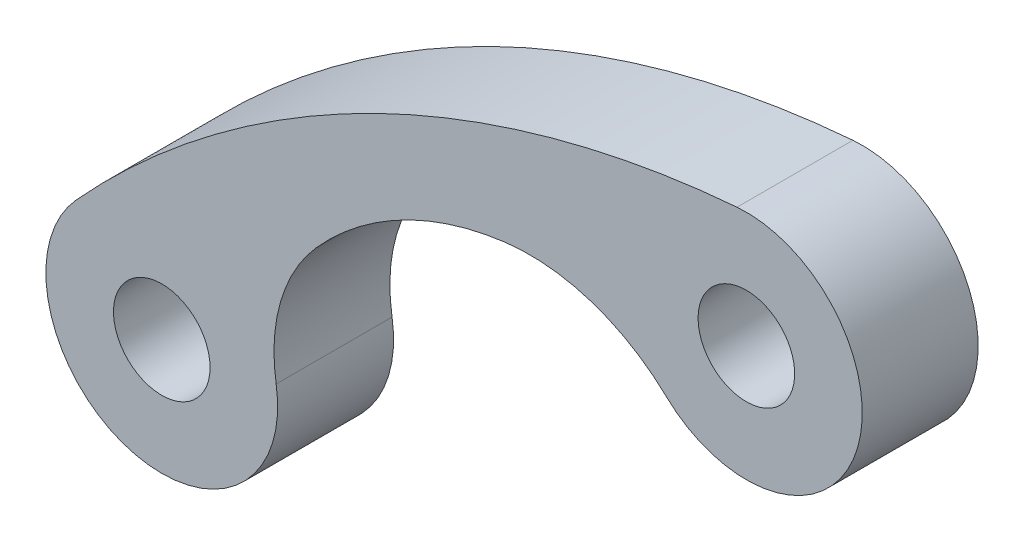
ISO-10303-21;
HEADER;
FILE_DESCRIPTION(('STEP AP214'),'2;1');
FILE_NAME('part.step','',(''),(''),'','','');
FILE_SCHEMA(('AUTOMOTIVE_DESIGN { 1 0 10303 214 1 1 1 1 }'));
ENDSEC;
DATA;
#1=APPLICATION_CONTEXT('core data for automotive mechanical design processes');
#2=APPLICATION_PROTOCOL_DEFINITION('international standard','automotive_design',2000,#1);
#3=PRODUCT_CONTEXT('',#1,'mechanical');
#4=PRODUCT('Part','Part','',(#3));
#5=PRODUCT_RELATED_PRODUCT_CATEGORY('part','',(#4));
#6=PRODUCT_DEFINITION_FORMATION('','',#4);
#7=PRODUCT_DEFINITION_CONTEXT('part definition',#1,'design');
#8=PRODUCT_DEFINITION('design','',#6,#7);
#9=PRODUCT_DEFINITION_SHAPE('','',#8);
#10=(LENGTH_UNIT() NAMED_UNIT(*) SI_UNIT(.MILLI.,.METRE.));
#11=(NAMED_UNIT(*) PLANE_ANGLE_UNIT() SI_UNIT($,.RADIAN.));
#12=(NAMED_UNIT(*) SI_UNIT($,.STERADIAN.) SOLID_ANGLE_UNIT());
#13=UNCERTAINTY_MEASURE_WITH_UNIT(LENGTH_MEASURE(1.E-05),#10,'distance_accuracy_value','');
#14=(GEOMETRIC_REPRESENTATION_CONTEXT(3) GLOBAL_UNCERTAINTY_ASSIGNED_CONTEXT((#13)) GLOBAL_UNIT_ASSIGNED_CONTEXT((#10,
#11,#12)) REPRESENTATION_CONTEXT('',''));
#15=CARTESIAN_POINT('',(0.,0.,0.));
#16=DIRECTION('',(0.,0.,1.));
#17=DIRECTION('',(1.,0.,0.));
#18=AXIS2_PLACEMENT_3D('',#15,#16,#17);
#19=CARTESIAN_POINT('',(0.,0.,7.));
#20=DIRECTION('',(0.,0.,1.));
#21=DIRECTION('',(1.,0.,0.));
#22=AXIS2_PLACEMENT_3D('',#19,#20,#21);
#23=CYLINDRICAL_SURFACE('',#22,3.);
#24=CARTESIAN_POINT('',(0.,0.,10.));
#25=DIRECTION('',(0.,0.,1.));
#26=DIRECTION('',(1.,0.,0.));
#27=AXIS2_PLACEMENT_3D('',#24,#25,#26);
#28=CIRCLE('',#27,3.);
#29=CARTESIAN_POINT('',(-2.21653776283587,2.02162319583115,10.));
#30=VERTEX_POINT('',#29);
#31=CARTESIAN_POINT('',(2.96055643657595,0.48487687699943,10.));
#32=VERTEX_POINT('',#31);
#33=EDGE_CURVE('E125',#30,#32,#28,.T.);
#34=ORIENTED_EDGE('',*,*,#33,.F.);
#35=DIRECTION('',(0.,0.,1.));
#36=VECTOR('',#35,1.);
#37=CARTESIAN_POINT('',(-2.21653776283587,2.02162319583115,7.));
#38=LINE('',#37,#36);
#39=CARTESIAN_POINT('',(-2.21653776283587,2.02162319583115,7.));
#40=VERTEX_POINT('',#39);
#41=EDGE_CURVE('E11',#40,#30,#38,.T.);
#42=ORIENTED_EDGE('',*,*,#41,.F.);
#43=CARTESIAN_POINT('',(0.,0.,7.));
#44=DIRECTION('',(0.,0.,1.));
#45=DIRECTION('',(1.,0.,0.));
#46=AXIS2_PLACEMENT_3D('',#43,#44,#45);
#47=CIRCLE('',#46,3.);
#48=CARTESIAN_POINT('',(2.96055643657595,0.48487687699943,7.));
#49=VERTEX_POINT('',#48);
#50=EDGE_CURVE('E139',#40,#49,#47,.T.);
#51=ORIENTED_EDGE('',*,*,#50,.T.);
#52=DIRECTION('',(0.,0.,1.));
#53=VECTOR('',#52,1.);
#54=CARTESIAN_POINT('',(2.96055643657595,0.48487687699943,7.));
#55=LINE('',#54,#53);
#56=EDGE_CURVE('E42',#49,#32,#55,.T.);
#57=ORIENTED_EDGE('',*,*,#56,.T.);
#58=EDGE_LOOP('',(#34,#42,#51,#57));
#59=FACE_BOUND('',#58,.T.);
#60=ADVANCED_FACE('F39',(#59),#23,.T.);
#61=CARTESIAN_POINT('',(16.9848295192665,-15.4912431040452,7.));
#62=DIRECTION('',(0.,0.,1.));
#63=DIRECTION('',(1.,0.,0.));
#64=AXIS2_PLACEMENT_3D('',#61,#62,#63);
#65=CYLINDRICAL_SURFACE('',#64,25.9883241387269);
#66=CARTESIAN_POINT('',(16.9848295192665,-15.4912431040452,10.));
#67=DIRECTION('',(0.,0.,1.));
#68=DIRECTION('',(1.,0.,0.));
#69=AXIS2_PLACEMENT_3D('',#66,#67,#68);
#70=CIRCLE('',#69,25.9883241387269);
#71=CARTESIAN_POINT('',(14.8888412285228,10.4124212047857,10.));
#72=VERTEX_POINT('',#71);
#73=EDGE_CURVE('E138',#30,#72,#70,.F.);
#74=ORIENTED_EDGE('',*,*,#73,.T.);
#75=DIRECTION('',(0.,0.,1.));
#76=VECTOR('',#75,1.);
#77=CARTESIAN_POINT('',(14.8888412285228,10.4124212047857,7.));
#78=LINE('',#77,#76);
#79=CARTESIAN_POINT('',(14.8888412285228,10.4124212047857,7.));
#80=VERTEX_POINT('',#79);
#81=EDGE_CURVE('E48',#80,#72,#78,.T.);
#82=ORIENTED_EDGE('',*,*,#81,.F.);
#83=CARTESIAN_POINT('',(16.9848295192665,-15.4912431040452,7.));
#84=DIRECTION('',(0.,0.,1.));
#85=DIRECTION('',(1.,0.,0.));
#86=AXIS2_PLACEMENT_3D('',#83,#84,#85);
#87=CIRCLE('',#86,25.9883241387269);
#88=EDGE_CURVE('E115',#40,#80,#87,.F.);
#89=ORIENTED_EDGE('',*,*,#88,.F.);
#90=ORIENTED_EDGE('',*,*,#41,.T.);
#91=EDGE_LOOP('',(#74,#82,#89,#90));
#92=FACE_BOUND('',#91,.T.);
#93=ADVANCED_FACE('F147',(#92),#65,.T.);
#94=CARTESIAN_POINT('',(15.130794685724,7.42219403539736,7.));
#95=DIRECTION('',(0.,0.,1.));
#96=DIRECTION('',(1.,0.,0.));
#97=AXIS2_PLACEMENT_3D('',#94,#95,#96);
#98=CYLINDRICAL_SURFACE('',#97,2.99999999999998);
#99=CARTESIAN_POINT('',(15.130794685724,7.42219403539736,10.));
#100=DIRECTION('',(0.,0.,1.));
#101=DIRECTION('',(1.,0.,0.));
#102=AXIS2_PLACEMENT_3D('',#99,#100,#101);
#103=CIRCLE('',#102,2.99999999999998);
#104=CARTESIAN_POINT('',(13.0628321585044,5.24882545505593,10.));
#105=VERTEX_POINT('',#104);
#106=EDGE_CURVE('E101',#105,#72,#103,.T.);
#107=ORIENTED_EDGE('',*,*,#106,.F.);
#108=DIRECTION('',(0.,0.,1.));
#109=VECTOR('',#108,1.);
#110=CARTESIAN_POINT('',(13.0628321585044,5.24882545505593,7.));
#111=LINE('',#110,#109);
#112=CARTESIAN_POINT('',(13.0628321585044,5.24882545505593,7.));
#113=VERTEX_POINT('',#112);
#114=EDGE_CURVE('E96',#113,#105,#111,.T.);
#115=ORIENTED_EDGE('',*,*,#114,.F.);
#116=CARTESIAN_POINT('',(15.130794685724,7.42219403539736,7.));
#117=DIRECTION('',(0.,0.,1.));
#118=DIRECTION('',(1.,0.,0.));
#119=AXIS2_PLACEMENT_3D('',#116,#117,#118);
#120=CIRCLE('',#119,2.99999999999998);
#121=EDGE_CURVE('E99',#113,#80,#120,.T.);
#122=ORIENTED_EDGE('',*,*,#121,.T.);
#123=ORIENTED_EDGE('',*,*,#81,.T.);
#124=EDGE_LOOP('',(#107,#115,#122,#123));
#125=FACE_BOUND('',#124,.T.);
#126=ADVANCED_FACE('F98',(#125),#98,.T.);
#127=CARTESIAN_POINT('',(9.52107516452226,1.52654167640606,7.));
#128=DIRECTION('',(0.,0.,1.));
#129=DIRECTION('',(1.,0.,0.));
#130=AXIS2_PLACEMENT_3D('',#127,#128,#129);
#131=CYLINDRICAL_SURFACE('',#130,5.13803845190182);
#132=CARTESIAN_POINT('',(9.52107516452226,1.52654167640606,10.));
#133=DIRECTION('',(0.,0.,1.));
#134=DIRECTION('',(1.,0.,0.));
#135=AXIS2_PLACEMENT_3D('',#132,#133,#134);
#136=CIRCLE('',#135,5.13803845190182);
#137=CARTESIAN_POINT('',(8.88421615339304,6.62495807104912,10.));
#138=VERTEX_POINT('',#137);
#139=EDGE_CURVE('E135',#138,#105,#136,.F.);
#140=ORIENTED_EDGE('',*,*,#139,.F.);
#141=DIRECTION('',(0.,0.,1.));
#142=VECTOR('',#141,1.);
#143=CARTESIAN_POINT('',(8.88421615339304,6.62495807104912,7.));
#144=LINE('',#143,#142);
#145=CARTESIAN_POINT('',(8.88421615339304,6.62495807104912,7.));
#146=VERTEX_POINT('',#145);
#147=EDGE_CURVE('E106',#146,#138,#144,.T.);
#148=ORIENTED_EDGE('',*,*,#147,.F.);
#149=CARTESIAN_POINT('',(9.52107516452226,1.52654167640606,7.));
#150=DIRECTION('',(0.,0.,1.));
#151=DIRECTION('',(1.,0.,0.));
#152=AXIS2_PLACEMENT_3D('',#149,#150,#151);
#153=CIRCLE('',#152,5.13803845190182);
#154=EDGE_CURVE('E113',#146,#113,#153,.F.);
#155=ORIENTED_EDGE('',*,*,#154,.T.);
#156=ORIENTED_EDGE('',*,*,#114,.T.);
#157=EDGE_LOOP('',(#140,#148,#155,#156));
#158=FACE_BOUND('',#157,.T.);
#159=ADVANCED_FACE('F117',(#158),#131,.F.);
#160=CARTESIAN_POINT('',(9.85679026823962,-1.16104750551823,7.));
#161=DIRECTION('',(0.,0.,1.));
#162=DIRECTION('',(1.,0.,0.));
#163=AXIS2_PLACEMENT_3D('',#160,#161,#162);
#164=CYLINDRICAL_SURFACE('',#163,7.84651408252145);
#165=CARTESIAN_POINT('',(9.85679026823962,-1.16104750551823,10.));
#166=DIRECTION('',(0.,0.,1.));
#167=DIRECTION('',(1.,0.,0.));
#168=AXIS2_PLACEMENT_3D('',#165,#166,#167);
#169=CIRCLE('',#168,7.84651408252145);
#170=CARTESIAN_POINT('',(4.,4.06061803347036,10.));
#171=VERTEX_POINT('',#170);
#172=EDGE_CURVE('E132',#171,#138,#169,.F.);
#173=ORIENTED_EDGE('',*,*,#172,.F.);
#174=DIRECTION('',(0.,0.,1.));
#175=VECTOR('',#174,1.);
#176=CARTESIAN_POINT('',(4.,4.06061803347036,7.));
#177=LINE('',#176,#175);
#178=CARTESIAN_POINT('',(4.,4.06061803347036,7.));
#179=VERTEX_POINT('',#178);
#180=EDGE_CURVE('E142',#179,#171,#177,.T.);
#181=ORIENTED_EDGE('',*,*,#180,.F.);
#182=CARTESIAN_POINT('',(9.85679026823962,-1.16104750551823,7.));
#183=DIRECTION('',(0.,0.,1.));
#184=DIRECTION('',(1.,0.,0.));
#185=AXIS2_PLACEMENT_3D('',#182,#183,#184);
#186=CIRCLE('',#185,7.84651408252145);
#187=EDGE_CURVE('E118',#179,#146,#186,.F.);
#188=ORIENTED_EDGE('',*,*,#187,.T.);
#189=ORIENTED_EDGE('',*,*,#147,.T.);
#190=EDGE_LOOP('',(#173,#181,#188,#189));
#191=FACE_BOUND('',#190,.T.);
#192=ADVANCED_FACE('F182',(#191),#164,.F.);
#193=CARTESIAN_POINT('',(7.22693484919939,1.18361992923564,7.));
#194=DIRECTION('',(0.,0.,1.));
#195=DIRECTION('',(1.,0.,0.));
#196=AXIS2_PLACEMENT_3D('',#193,#194,#195);
#197=CYLINDRICAL_SURFACE('',#196,4.32321947311812);
#198=CARTESIAN_POINT('',(7.22693484919939,1.18361992923564,10.));
#199=DIRECTION('',(0.,0.,1.));
#200=DIRECTION('',(1.,0.,0.));
#201=AXIS2_PLACEMENT_3D('',#198,#199,#200);
#202=CIRCLE('',#201,4.32321947311812);
#203=EDGE_CURVE('E128',#32,#171,#202,.F.);
#204=ORIENTED_EDGE('',*,*,#203,.F.);
#205=ORIENTED_EDGE('',*,*,#56,.F.);
#206=CARTESIAN_POINT('',(7.22693484919939,1.18361992923564,7.));
#207=DIRECTION('',(0.,0.,1.));
#208=DIRECTION('',(1.,0.,0.));
#209=AXIS2_PLACEMENT_3D('',#206,#207,#208);
#210=CIRCLE('',#209,4.32321947311812);
#211=EDGE_CURVE('E120',#49,#179,#210,.F.);
#212=ORIENTED_EDGE('',*,*,#211,.T.);
#213=ORIENTED_EDGE('',*,*,#180,.T.);
#214=EDGE_LOOP('',(#204,#205,#212,#213));
#215=FACE_BOUND('',#214,.T.);
#216=ADVANCED_FACE('F144',(#215),#197,.F.);
#217=CARTESIAN_POINT('',(0.,0.,7.));
#218=DIRECTION('',(0.,0.,1.));
#219=DIRECTION('',(1.,0.,0.));
#220=AXIS2_PLACEMENT_3D('',#217,#218,#219);
#221=PLANE('',#220);
#222=CARTESIAN_POINT('',(0.,0.,7.));
#223=DIRECTION('',(0.,0.,1.));
#224=DIRECTION('',(1.,0.,0.));
#225=AXIS2_PLACEMENT_3D('',#222,#223,#224);
#226=CIRCLE('',#225,1.25);
#227=CARTESIAN_POINT('',(1.25,0.,7.));
#228=VERTEX_POINT('',#227);
#229=EDGE_CURVE('E155',#228,#228,#226,.F.);
#230=ORIENTED_EDGE('',*,*,#229,.F.);
#231=EDGE_LOOP('',(#230));
#232=FACE_BOUND('',#231,.T.);
#233=CARTESIAN_POINT('',(15.130794685724,7.42219403539736,7.));
#234=DIRECTION('',(0.,0.,1.));
#235=DIRECTION('',(1.,0.,0.));
#236=AXIS2_PLACEMENT_3D('',#233,#234,#235);
#237=CIRCLE('',#236,1.25);
#238=CARTESIAN_POINT('',(16.380794685724,7.42219403539736,7.));
#239=VERTEX_POINT('',#238);
#240=EDGE_CURVE('E129',#239,#239,#237,.T.);
#241=ORIENTED_EDGE('',*,*,#240,.T.);
#242=EDGE_LOOP('',(#241));
#243=FACE_BOUND('',#242,.T.);
#244=ORIENTED_EDGE('',*,*,#50,.F.);
#245=ORIENTED_EDGE('',*,*,#88,.T.);
#246=ORIENTED_EDGE('',*,*,#121,.F.);
#247=ORIENTED_EDGE('',*,*,#154,.F.);
#248=ORIENTED_EDGE('',*,*,#187,.F.);
#249=ORIENTED_EDGE('',*,*,#211,.F.);
#250=EDGE_LOOP('',(#244,#245,#246,#247,#248,#249));
#251=FACE_BOUND('',#250,.T.);
#252=ADVANCED_FACE('F111',(#232,#243,#251),#221,.F.);
#253=CARTESIAN_POINT('',(0.,0.,10.));
#254=DIRECTION('',(0.,0.,1.));
#255=DIRECTION('',(1.,0.,0.));
#256=AXIS2_PLACEMENT_3D('',#253,#254,#255);
#257=PLANE('',#256);
#258=CARTESIAN_POINT('',(0.,0.,10.));
#259=DIRECTION('',(0.,0.,1.));
#260=DIRECTION('',(1.,0.,0.));
#261=AXIS2_PLACEMENT_3D('',#258,#259,#260);
#262=CIRCLE('',#261,1.25);
#263=CARTESIAN_POINT('',(1.25,0.,10.));
#264=VERTEX_POINT('',#263);
#265=EDGE_CURVE('E158',#264,#264,#262,.T.);
#266=ORIENTED_EDGE('',*,*,#265,.F.);
#267=EDGE_LOOP('',(#266));
#268=FACE_BOUND('',#267,.T.);
#269=CARTESIAN_POINT('',(15.130794685724,7.42219403539736,10.));
#270=DIRECTION('',(0.,0.,-1.));
#271=DIRECTION('',(-1.,0.,0.));
#272=AXIS2_PLACEMENT_3D('',#269,#270,#271);
#273=CIRCLE('',#272,1.25);
#274=CARTESIAN_POINT('',(13.880794685724,7.42219403539736,10.));
#275=VERTEX_POINT('',#274);
#276=EDGE_CURVE('E152',#275,#275,#273,.T.);
#277=ORIENTED_EDGE('',*,*,#276,.T.);
#278=EDGE_LOOP('',(#277));
#279=FACE_BOUND('',#278,.T.);
#280=ORIENTED_EDGE('',*,*,#33,.T.);
#281=ORIENTED_EDGE('',*,*,#203,.T.);
#282=ORIENTED_EDGE('',*,*,#172,.T.);
#283=ORIENTED_EDGE('',*,*,#139,.T.);
#284=ORIENTED_EDGE('',*,*,#106,.T.);
#285=ORIENTED_EDGE('',*,*,#73,.F.);
#286=EDGE_LOOP('',(#280,#281,#282,#283,#284,#285));
#287=FACE_BOUND('',#286,.T.);
#288=ADVANCED_FACE('F146',(#268,#279,#287),#257,.T.);
#289=CARTESIAN_POINT('',(15.130794685724,7.42219403539736,10.));
#290=DIRECTION('',(0.,0.,-1.));
#291=DIRECTION('',(-1.,0.,0.));
#292=AXIS2_PLACEMENT_3D('',#289,#290,#291);
#293=CYLINDRICAL_SURFACE('',#292,1.25);
#294=ORIENTED_EDGE('',*,*,#276,.F.);
#295=EDGE_LOOP('',(#294));
#296=FACE_BOUND('',#295,.T.);
#297=ORIENTED_EDGE('',*,*,#240,.F.);
#298=EDGE_LOOP('',(#297));
#299=FACE_BOUND('',#298,.T.);
#300=ADVANCED_FACE('F167',(#296,#299),#293,.F.);
#301=CARTESIAN_POINT('',(0.,0.,-0.000999999999999265));
#302=DIRECTION('',(0.,0.,1.));
#303=DIRECTION('',(1.,0.,0.));
#304=AXIS2_PLACEMENT_3D('',#301,#302,#303);
#305=CYLINDRICAL_SURFACE('',#304,1.25);
#306=ORIENTED_EDGE('',*,*,#265,.T.);
#307=EDGE_LOOP('',(#306));
#308=FACE_BOUND('',#307,.T.);
#309=ORIENTED_EDGE('',*,*,#229,.T.);
#310=EDGE_LOOP('',(#309));
#311=FACE_BOUND('',#310,.T.);
#312=ADVANCED_FACE('F162',(#308,#311),#305,.F.);
#313=CLOSED_SHELL('',(#60,#93,#126,#159,#192,#216,#252,#288,#300,#312));
#314=MANIFOLD_SOLID_BREP('B2',#313);
#315=ADVANCED_BREP_SHAPE_REPRESENTATION('',(#18,#314),#14);
#316=SHAPE_DEFINITION_REPRESENTATION(#9,#315);
ENDSEC;
END-ISO-10303-21;
